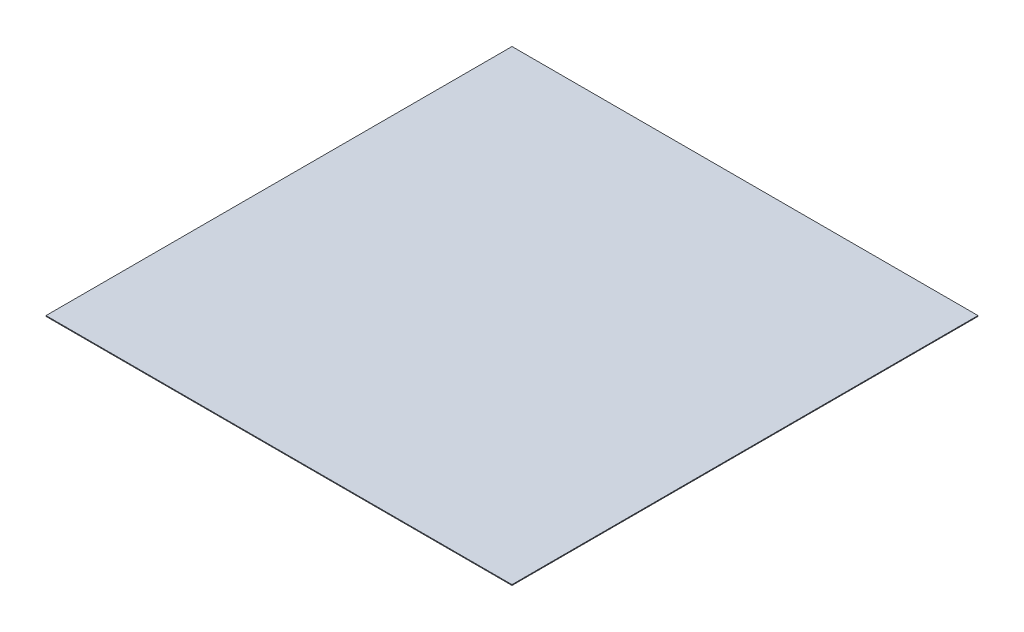
ISO-10303-21;
HEADER;
FILE_DESCRIPTION(('STEP AP214'),'2;1');
FILE_NAME('part.step','',(''),(''),'','','');
FILE_SCHEMA(('AUTOMOTIVE_DESIGN { 1 0 10303 214 1 1 1 1 }'));
ENDSEC;
DATA;
#1=APPLICATION_CONTEXT('core data for automotive mechanical design processes');
#2=APPLICATION_PROTOCOL_DEFINITION('international standard','automotive_design',2000,#1);
#3=PRODUCT_CONTEXT('',#1,'mechanical');
#4=PRODUCT('Part','Part','',(#3));
#5=PRODUCT_RELATED_PRODUCT_CATEGORY('part','',(#4));
#6=PRODUCT_DEFINITION_FORMATION('','',#4);
#7=PRODUCT_DEFINITION_CONTEXT('part definition',#1,'design');
#8=PRODUCT_DEFINITION('design','',#6,#7);
#9=PRODUCT_DEFINITION_SHAPE('','',#8);
#10=(LENGTH_UNIT() NAMED_UNIT(*) SI_UNIT(.MILLI.,.METRE.));
#11=(NAMED_UNIT(*) PLANE_ANGLE_UNIT() SI_UNIT($,.RADIAN.));
#12=(NAMED_UNIT(*) SI_UNIT($,.STERADIAN.) SOLID_ANGLE_UNIT());
#13=UNCERTAINTY_MEASURE_WITH_UNIT(LENGTH_MEASURE(1.E-05),#10,'distance_accuracy_value','');
#14=(GEOMETRIC_REPRESENTATION_CONTEXT(3) GLOBAL_UNCERTAINTY_ASSIGNED_CONTEXT((#13)) GLOBAL_UNIT_ASSIGNED_CONTEXT((#10,
#11,#12)) REPRESENTATION_CONTEXT('',''));
#15=CARTESIAN_POINT('',(0.,0.,0.));
#16=DIRECTION('',(0.,0.,1.));
#17=DIRECTION('',(1.,0.,0.));
#18=AXIS2_PLACEMENT_3D('',#15,#16,#17);
#19=CARTESIAN_POINT('',(38.1,0.127,38.1));
#20=DIRECTION('',(-1.,0.,0.));
#21=DIRECTION('',(0.,0.,1.));
#22=AXIS2_PLACEMENT_3D('',#19,#20,#21);
#23=PLANE('',#22);
#24=DIRECTION('',(0.,0.,-1.));
#25=VECTOR('',#24,1.);
#26=CARTESIAN_POINT('',(38.1,0.,38.1));
#27=LINE('',#26,#25);
#28=CARTESIAN_POINT('',(38.1,0.,38.1));
#29=VERTEX_POINT('',#28);
#30=CARTESIAN_POINT('',(38.1,0.,-38.1));
#31=VERTEX_POINT('',#30);
#32=EDGE_CURVE('E113',#29,#31,#27,.T.);
#33=ORIENTED_EDGE('',*,*,#32,.T.);
#34=DIRECTION('',(0.,-1.,0.));
#35=VECTOR('',#34,1.);
#36=CARTESIAN_POINT('',(38.1,0.127,-38.1));
#37=LINE('',#36,#35);
#38=CARTESIAN_POINT('',(38.1,0.127,-38.1));
#39=VERTEX_POINT('',#38);
#40=EDGE_CURVE('E11',#39,#31,#37,.T.);
#41=ORIENTED_EDGE('',*,*,#40,.F.);
#42=DIRECTION('',(0.,0.,-1.));
#43=VECTOR('',#42,1.);
#44=CARTESIAN_POINT('',(38.1,0.127,38.1));
#45=LINE('',#44,#43);
#46=CARTESIAN_POINT('',(38.1,0.127,38.1));
#47=VERTEX_POINT('',#46);
#48=EDGE_CURVE('E97',#47,#39,#45,.T.);
#49=ORIENTED_EDGE('',*,*,#48,.F.);
#50=DIRECTION('',(0.,-1.,0.));
#51=VECTOR('',#50,1.);
#52=CARTESIAN_POINT('',(38.1,0.127,38.1));
#53=LINE('',#52,#51);
#54=EDGE_CURVE('E109',#47,#29,#53,.T.);
#55=ORIENTED_EDGE('',*,*,#54,.T.);
#56=EDGE_LOOP('',(#33,#41,#49,#55));
#57=FACE_BOUND('',#56,.T.);
#58=ADVANCED_FACE('F45',(#57),#23,.F.);
#59=CARTESIAN_POINT('',(-38.1,0.127,-38.1));
#60=DIRECTION('',(0.,0.,1.));
#61=DIRECTION('',(1.,0.,0.));
#62=AXIS2_PLACEMENT_3D('',#59,#60,#61);
#63=PLANE('',#62);
#64=DIRECTION('',(-1.,0.,0.));
#65=VECTOR('',#64,1.);
#66=CARTESIAN_POINT('',(-38.1,0.,-38.1));
#67=LINE('',#66,#65);
#68=CARTESIAN_POINT('',(-38.1,0.,-38.1));
#69=VERTEX_POINT('',#68);
#70=EDGE_CURVE('E102',#31,#69,#67,.T.);
#71=ORIENTED_EDGE('',*,*,#70,.T.);
#72=DIRECTION('',(0.,-1.,0.));
#73=VECTOR('',#72,1.);
#74=CARTESIAN_POINT('',(-38.1,0.127,-38.1));
#75=LINE('',#74,#73);
#76=CARTESIAN_POINT('',(-38.1,0.127,-38.1));
#77=VERTEX_POINT('',#76);
#78=EDGE_CURVE('E54',#77,#69,#75,.T.);
#79=ORIENTED_EDGE('',*,*,#78,.F.);
#80=DIRECTION('',(-1.,0.,0.));
#81=VECTOR('',#80,1.);
#82=CARTESIAN_POINT('',(-38.1,0.127,-38.1));
#83=LINE('',#82,#81);
#84=EDGE_CURVE('E92',#39,#77,#83,.T.);
#85=ORIENTED_EDGE('',*,*,#84,.F.);
#86=ORIENTED_EDGE('',*,*,#40,.T.);
#87=EDGE_LOOP('',(#71,#79,#85,#86));
#88=FACE_BOUND('',#87,.T.);
#89=ADVANCED_FACE('F101',(#88),#63,.F.);
#90=CARTESIAN_POINT('',(-38.1,0.127,38.1));
#91=DIRECTION('',(1.,0.,0.));
#92=DIRECTION('',(0.,0.,-1.));
#93=AXIS2_PLACEMENT_3D('',#90,#91,#92);
#94=PLANE('',#93);
#95=DIRECTION('',(0.,0.,1.));
#96=VECTOR('',#95,1.);
#97=CARTESIAN_POINT('',(-38.1,0.,38.1));
#98=LINE('',#97,#96);
#99=CARTESIAN_POINT('',(-38.1,0.,38.1));
#100=VERTEX_POINT('',#99);
#101=EDGE_CURVE('E79',#69,#100,#98,.T.);
#102=ORIENTED_EDGE('',*,*,#101,.T.);
#103=DIRECTION('',(0.,-1.,0.));
#104=VECTOR('',#103,1.);
#105=CARTESIAN_POINT('',(-38.1,0.127,38.1));
#106=LINE('',#105,#104);
#107=CARTESIAN_POINT('',(-38.1,0.127,38.1));
#108=VERTEX_POINT('',#107);
#109=EDGE_CURVE('E104',#108,#100,#106,.T.);
#110=ORIENTED_EDGE('',*,*,#109,.F.);
#111=DIRECTION('',(0.,0.,1.));
#112=VECTOR('',#111,1.);
#113=CARTESIAN_POINT('',(-38.1,0.127,38.1));
#114=LINE('',#113,#112);
#115=EDGE_CURVE('E95',#77,#108,#114,.T.);
#116=ORIENTED_EDGE('',*,*,#115,.F.);
#117=ORIENTED_EDGE('',*,*,#78,.T.);
#118=EDGE_LOOP('',(#102,#110,#116,#117));
#119=FACE_BOUND('',#118,.T.);
#120=ADVANCED_FACE('F105',(#119),#94,.F.);
#121=CARTESIAN_POINT('',(-38.1,0.127,38.1));
#122=DIRECTION('',(0.,0.,-1.));
#123=DIRECTION('',(-1.,0.,0.));
#124=AXIS2_PLACEMENT_3D('',#121,#122,#123);
#125=PLANE('',#124);
#126=DIRECTION('',(1.,0.,0.));
#127=VECTOR('',#126,1.);
#128=CARTESIAN_POINT('',(-38.1,0.,38.1));
#129=LINE('',#128,#127);
#130=EDGE_CURVE('E85',#100,#29,#129,.T.);
#131=ORIENTED_EDGE('',*,*,#130,.T.);
#132=ORIENTED_EDGE('',*,*,#54,.F.);
#133=DIRECTION('',(1.,0.,0.));
#134=VECTOR('',#133,1.);
#135=CARTESIAN_POINT('',(-38.1,0.127,38.1));
#136=LINE('',#135,#134);
#137=EDGE_CURVE('E62',#108,#47,#136,.T.);
#138=ORIENTED_EDGE('',*,*,#137,.F.);
#139=ORIENTED_EDGE('',*,*,#109,.T.);
#140=EDGE_LOOP('',(#131,#132,#138,#139));
#141=FACE_BOUND('',#140,.T.);
#142=ADVANCED_FACE('F126',(#141),#125,.F.);
#143=CARTESIAN_POINT('',(0.,0.127,0.));
#144=DIRECTION('',(0.,-1.,0.));
#145=DIRECTION('',(0.,0.,-1.));
#146=AXIS2_PLACEMENT_3D('',#143,#144,#145);
#147=PLANE('',#146);
#148=ORIENTED_EDGE('',*,*,#48,.T.);
#149=ORIENTED_EDGE('',*,*,#84,.T.);
#150=ORIENTED_EDGE('',*,*,#115,.T.);
#151=ORIENTED_EDGE('',*,*,#137,.T.);
#152=EDGE_LOOP('',(#148,#149,#150,#151));
#153=FACE_BOUND('',#152,.T.);
#154=ADVANCED_FACE('F93',(#153),#147,.F.);
#155=CARTESIAN_POINT('',(0.,0.,0.));
#156=DIRECTION('',(0.,-1.,0.));
#157=DIRECTION('',(0.,0.,-1.));
#158=AXIS2_PLACEMENT_3D('',#155,#156,#157);
#159=PLANE('',#158);
#160=ORIENTED_EDGE('',*,*,#32,.F.);
#161=ORIENTED_EDGE('',*,*,#130,.F.);
#162=ORIENTED_EDGE('',*,*,#101,.F.);
#163=ORIENTED_EDGE('',*,*,#70,.F.);
#164=EDGE_LOOP('',(#160,#161,#162,#163));
#165=FACE_BOUND('',#164,.T.);
#166=ADVANCED_FACE('F129',(#165),#159,.T.);
#167=CLOSED_SHELL('',(#58,#89,#120,#142,#154,#166));
#168=MANIFOLD_SOLID_BREP('B2',#167);
#169=ADVANCED_BREP_SHAPE_REPRESENTATION('',(#18,#168),#14);
#170=SHAPE_DEFINITION_REPRESENTATION(#9,#169);
ENDSEC;
END-ISO-10303-21;
